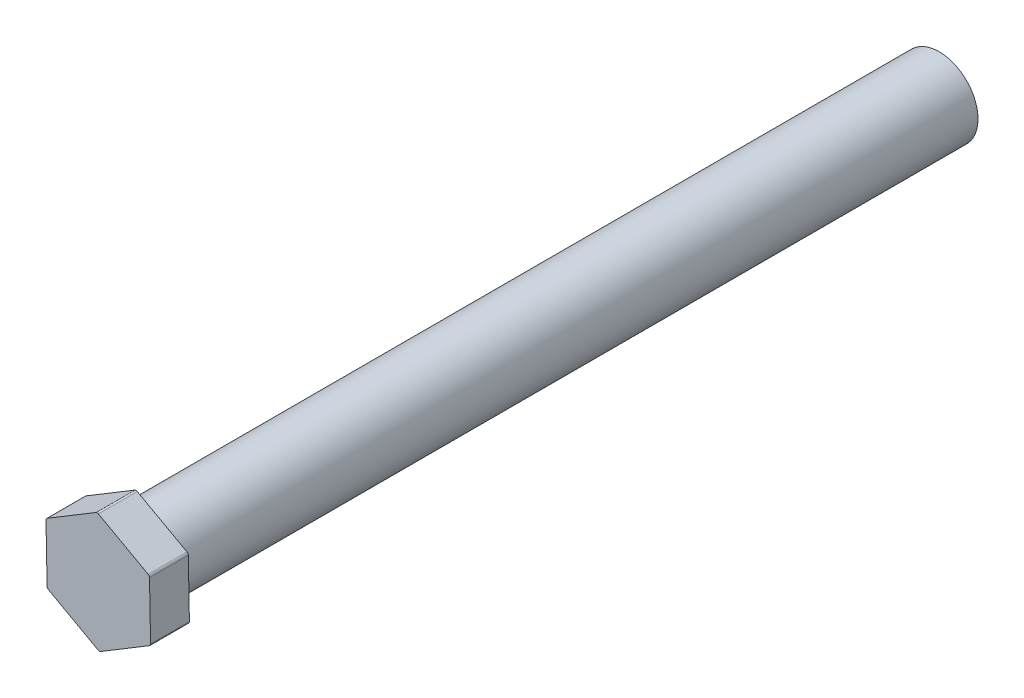
ISO-10303-21;
HEADER;
FILE_DESCRIPTION(('STEP AP214'),'2;1');
FILE_NAME('part.step','',(''),(''),'','','');
FILE_SCHEMA(('AUTOMOTIVE_DESIGN { 1 0 10303 214 1 1 1 1 }'));
ENDSEC;
DATA;
#1=APPLICATION_CONTEXT('core data for automotive mechanical design processes');
#2=APPLICATION_PROTOCOL_DEFINITION('international standard','automotive_design',2000,#1);
#3=PRODUCT_CONTEXT('',#1,'mechanical');
#4=PRODUCT('Part','Part','',(#3));
#5=PRODUCT_RELATED_PRODUCT_CATEGORY('part','',(#4));
#6=PRODUCT_DEFINITION_FORMATION('','',#4);
#7=PRODUCT_DEFINITION_CONTEXT('part definition',#1,'design');
#8=PRODUCT_DEFINITION('design','',#6,#7);
#9=PRODUCT_DEFINITION_SHAPE('','',#8);
#10=(LENGTH_UNIT() NAMED_UNIT(*) SI_UNIT(.MILLI.,.METRE.));
#11=(NAMED_UNIT(*) PLANE_ANGLE_UNIT() SI_UNIT($,.RADIAN.));
#12=(NAMED_UNIT(*) SI_UNIT($,.STERADIAN.) SOLID_ANGLE_UNIT());
#13=UNCERTAINTY_MEASURE_WITH_UNIT(LENGTH_MEASURE(1.E-05),#10,'distance_accuracy_value','');
#14=(GEOMETRIC_REPRESENTATION_CONTEXT(3) GLOBAL_UNCERTAINTY_ASSIGNED_CONTEXT((#13)) GLOBAL_UNIT_ASSIGNED_CONTEXT((#10,
#11,#12)) REPRESENTATION_CONTEXT('',''));
#15=CARTESIAN_POINT('',(0.,0.,0.));
#16=DIRECTION('',(0.,0.,1.));
#17=DIRECTION('',(1.,0.,0.));
#18=AXIS2_PLACEMENT_3D('',#15,#16,#17);
#19=CARTESIAN_POINT('',(-43.2,0.,-62.));
#20=DIRECTION('',(0.,0.,1.));
#21=DIRECTION('',(1.,0.,0.));
#22=AXIS2_PLACEMENT_3D('',#19,#20,#21);
#23=CYLINDRICAL_SURFACE('',#22,3.);
#24=CARTESIAN_POINT('',(-43.2,0.,-62.));
#25=DIRECTION('',(0.,0.,1.));
#26=DIRECTION('',(1.,0.,0.));
#27=AXIS2_PLACEMENT_3D('',#24,#25,#26);
#28=CIRCLE('',#27,3.);
#29=CARTESIAN_POINT('',(-40.2,0.,-62.));
#30=VERTEX_POINT('',#29);
#31=EDGE_CURVE('E11',#30,#30,#28,.T.);
#32=ORIENTED_EDGE('',*,*,#31,.T.);
#33=EDGE_LOOP('',(#32));
#34=FACE_BOUND('',#33,.T.);
#35=CARTESIAN_POINT('',(-43.2,0.,0.));
#36=DIRECTION('',(0.,0.,1.));
#37=DIRECTION('',(1.,0.,0.));
#38=AXIS2_PLACEMENT_3D('',#35,#36,#37);
#39=CIRCLE('',#38,3.);
#40=CARTESIAN_POINT('',(-40.2,0.,0.));
#41=VERTEX_POINT('',#40);
#42=EDGE_CURVE('E43',#41,#41,#39,.T.);
#43=ORIENTED_EDGE('',*,*,#42,.F.);
#44=EDGE_LOOP('',(#43));
#45=FACE_BOUND('',#44,.T.);
#46=ADVANCED_FACE('F40',(#34,#45),#23,.T.);
#47=CARTESIAN_POINT('',(-43.2,0.,-62.));
#48=DIRECTION('',(0.,0.,1.));
#49=DIRECTION('',(1.,0.,0.));
#50=AXIS2_PLACEMENT_3D('',#47,#48,#49);
#51=PLANE('',#50);
#52=ORIENTED_EDGE('',*,*,#31,.F.);
#53=EDGE_LOOP('',(#52));
#54=FACE_BOUND('',#53,.T.);
#55=ADVANCED_FACE('F249',(#54),#51,.F.);
#56=CARTESIAN_POINT('',(-43.2845629857805,4.38790491990159,3.));
#57=DIRECTION('',(0.,0.,-1.));
#58=DIRECTION('',(-1.,0.,0.));
#59=AXIS2_PLACEMENT_3D('',#56,#57,#58);
#60=CYLINDRICAL_SURFACE('',#59,0.2);
#61=CARTESIAN_POINT('',(-43.2845629857805,4.38790491990159,0.));
#62=DIRECTION('',(0.,0.,1.));
#63=DIRECTION('',(1.,0.,0.));
#64=AXIS2_PLACEMENT_3D('',#61,#62,#63);
#65=CIRCLE('',#64,0.2);
#66=CARTESIAN_POINT('',(-43.1879189110778,4.56300467097185,0.));
#67=VERTEX_POINT('',#66);
#68=CARTESIAN_POINT('',(-43.3878817810523,4.55915101925447,0.));
#69=VERTEX_POINT('',#68);
#70=EDGE_CURVE('E167',#67,#69,#65,.T.);
#71=ORIENTED_EDGE('',*,*,#70,.T.);
#72=DIRECTION('',(0.,0.,-1.));
#73=VECTOR('',#72,1.);
#74=CARTESIAN_POINT('',(-43.3878817810523,4.55915101925447,3.));
#75=LINE('',#74,#73);
#76=CARTESIAN_POINT('',(-43.3878817810523,4.55915101925447,3.));
#77=VERTEX_POINT('',#76);
#78=EDGE_CURVE('E236',#77,#69,#75,.T.);
#79=ORIENTED_EDGE('',*,*,#78,.F.);
#80=CARTESIAN_POINT('',(-43.2845629857805,4.38790491990159,3.));
#81=DIRECTION('',(0.,0.,1.));
#82=DIRECTION('',(1.,0.,0.));
#83=AXIS2_PLACEMENT_3D('',#80,#81,#82);
#84=CIRCLE('',#83,0.2);
#85=CARTESIAN_POINT('',(-43.1879189110778,4.56300467097185,3.));
#86=VERTEX_POINT('',#85);
#87=EDGE_CURVE('E203',#86,#77,#84,.T.);
#88=ORIENTED_EDGE('',*,*,#87,.F.);
#89=DIRECTION('',(0.,0.,-1.));
#90=VECTOR('',#89,1.);
#91=CARTESIAN_POINT('',(-43.1879189110778,4.56300467097185,3.));
#92=LINE('',#91,#90);
#93=EDGE_CURVE('E163',#86,#67,#92,.T.);
#94=ORIENTED_EDGE('',*,*,#93,.T.);
#95=EDGE_LOOP('',(#71,#79,#88,#94));
#96=FACE_BOUND('',#95,.T.);
#97=ADVANCED_FACE('F254',(#96),#60,.T.);
#98=CARTESIAN_POINT('',(-43.3878817810523,4.55915101925447,3.));
#99=DIRECTION('',(0.516593976359207,-0.856230496764384,0.));
#100=DIRECTION('',(0.856230496764384,0.516593976359207,0.));
#101=AXIS2_PLACEMENT_3D('',#98,#99,#100);
#102=PLANE('',#101);
#103=DIRECTION('',(-0.856230496764384,-0.516593976359207,0.));
#104=VECTOR('',#103,1.);
#105=CARTESIAN_POINT('',(-43.3878817810523,4.55915101925447,0.));
#106=LINE('',#105,#104);
#107=CARTESIAN_POINT('',(-47.1456374181876,2.29196486539792,0.));
#108=VERTEX_POINT('',#107);
#109=EDGE_CURVE('E171',#69,#108,#106,.T.);
#110=ORIENTED_EDGE('',*,*,#109,.T.);
#111=DIRECTION('',(0.,0.,-1.));
#112=VECTOR('',#111,1.);
#113=CARTESIAN_POINT('',(-47.1456374181876,2.29196486539792,3.));
#114=LINE('',#113,#112);
#115=CARTESIAN_POINT('',(-47.1456374181876,2.29196486539792,3.));
#116=VERTEX_POINT('',#115);
#117=EDGE_CURVE('E232',#116,#108,#114,.T.);
#118=ORIENTED_EDGE('',*,*,#117,.F.);
#119=DIRECTION('',(-0.856230496764384,-0.516593976359207,0.));
#120=VECTOR('',#119,1.);
#121=CARTESIAN_POINT('',(-43.3878817810523,4.55915101925447,3.));
#122=LINE('',#121,#120);
#123=EDGE_CURVE('E113',#77,#116,#122,.T.);
#124=ORIENTED_EDGE('',*,*,#123,.F.);
#125=ORIENTED_EDGE('',*,*,#78,.T.);
#126=EDGE_LOOP('',(#110,#118,#124,#125));
#127=FACE_BOUND('',#126,.T.);
#128=ADVANCED_FACE('F260',(#127),#102,.F.);
#129=CARTESIAN_POINT('',(-47.0423186229158,2.12071876604504,3.));
#130=DIRECTION('',(0.,0.,-1.));
#131=DIRECTION('',(-1.,0.,0.));
#132=AXIS2_PLACEMENT_3D('',#129,#130,#131);
#133=CYLINDRICAL_SURFACE('',#132,0.200000000000001);
#134=CARTESIAN_POINT('',(-47.0423186229158,2.12071876604504,0.));
#135=DIRECTION('',(0.,0.,1.));
#136=DIRECTION('',(1.,0.,0.));
#137=AXIS2_PLACEMENT_3D('',#134,#135,#136);
#138=CIRCLE('',#137,0.200000000000001);
#139=CARTESIAN_POINT('',(-47.2422814928903,2.11686511432766,0.));
#140=VERTEX_POINT('',#139);
#141=EDGE_CURVE('E174',#108,#140,#138,.T.);
#142=ORIENTED_EDGE('',*,*,#141,.T.);
#143=DIRECTION('',(0.,0.,-1.));
#144=VECTOR('',#143,1.);
#145=CARTESIAN_POINT('',(-47.2422814928903,2.11686511432766,3.));
#146=LINE('',#145,#144);
#147=CARTESIAN_POINT('',(-47.2422814928903,2.11686511432766,3.));
#148=VERTEX_POINT('',#147);
#149=EDGE_CURVE('E228',#148,#140,#146,.T.);
#150=ORIENTED_EDGE('',*,*,#149,.F.);
#151=CARTESIAN_POINT('',(-47.0423186229158,2.12071876604504,3.));
#152=DIRECTION('',(0.,0.,1.));
#153=DIRECTION('',(1.,0.,0.));
#154=AXIS2_PLACEMENT_3D('',#151,#152,#153);
#155=CIRCLE('',#154,0.200000000000001);
#156=EDGE_CURVE('E438',#116,#148,#155,.T.);
#157=ORIENTED_EDGE('',*,*,#156,.F.);
#158=ORIENTED_EDGE('',*,*,#117,.T.);
#159=EDGE_LOOP('',(#142,#150,#157,#158));
#160=FACE_BOUND('',#159,.T.);
#161=ADVANCED_FACE('F266',(#160),#133,.T.);
#162=CARTESIAN_POINT('',(-47.2422814928903,2.11686511432766,3.));
#163=DIRECTION('',(0.999814349872529,0.0192682585868978,0.));
#164=DIRECTION('',(-0.0192682585868978,0.999814349872529,0.));
#165=AXIS2_PLACEMENT_3D('',#162,#163,#164);
#166=PLANE('',#165);
#167=DIRECTION('',(0.0192682585868978,-0.999814349872529,0.));
#168=VECTOR('',#167,1.);
#169=CARTESIAN_POINT('',(-47.2422814928903,2.11686511432766,0.));
#170=LINE('',#169,#168);
#171=CARTESIAN_POINT('',(-47.1577185071098,-2.27103980557393,0.));
#172=VERTEX_POINT('',#171);
#173=EDGE_CURVE('E177',#140,#172,#170,.T.);
#174=ORIENTED_EDGE('',*,*,#173,.T.);
#175=DIRECTION('',(0.,0.,-1.));
#176=VECTOR('',#175,1.);
#177=CARTESIAN_POINT('',(-47.1577185071098,-2.27103980557393,3.));
#178=LINE('',#177,#176);
#179=CARTESIAN_POINT('',(-47.1577185071098,-2.27103980557393,3.));
#180=VERTEX_POINT('',#179);
#181=EDGE_CURVE('E225',#180,#172,#178,.T.);
#182=ORIENTED_EDGE('',*,*,#181,.F.);
#183=DIRECTION('',(0.0192682585868978,-0.999814349872529,0.));
#184=VECTOR('',#183,1.);
#185=CARTESIAN_POINT('',(-47.2422814928903,2.11686511432766,3.));
#186=LINE('',#185,#184);
#187=EDGE_CURVE('E443',#148,#180,#186,.T.);
#188=ORIENTED_EDGE('',*,*,#187,.F.);
#189=ORIENTED_EDGE('',*,*,#149,.T.);
#190=EDGE_LOOP('',(#174,#182,#188,#189));
#191=FACE_BOUND('',#190,.T.);
#192=ADVANCED_FACE('F269',(#191),#166,.F.);
#193=CARTESIAN_POINT('',(-46.9577556371353,-2.26718615385655,3.));
#194=DIRECTION('',(0.,0.,-1.));
#195=DIRECTION('',(-1.,0.,0.));
#196=AXIS2_PLACEMENT_3D('',#193,#194,#195);
#197=CYLINDRICAL_SURFACE('',#196,0.200000000000005);
#198=CARTESIAN_POINT('',(-46.9577556371353,-2.26718615385655,0.));
#199=DIRECTION('',(0.,0.,-1.));
#200=DIRECTION('',(-1.,0.,0.));
#201=AXIS2_PLACEMENT_3D('',#198,#199,#200);
#202=CIRCLE('',#201,0.200000000000005);
#203=CARTESIAN_POINT('',(-47.0543997118379,-2.44228590492681,0.));
#204=VERTEX_POINT('',#203);
#205=EDGE_CURVE('E181',#204,#172,#202,.T.);
#206=ORIENTED_EDGE('',*,*,#205,.F.);
#207=DIRECTION('',(0.,0.,-1.));
#208=VECTOR('',#207,1.);
#209=CARTESIAN_POINT('',(-47.0543997118379,-2.44228590492681,3.));
#210=LINE('',#209,#208);
#211=CARTESIAN_POINT('',(-47.0543997118379,-2.44228590492681,3.));
#212=VERTEX_POINT('',#211);
#213=EDGE_CURVE('E222',#212,#204,#210,.T.);
#214=ORIENTED_EDGE('',*,*,#213,.F.);
#215=CARTESIAN_POINT('',(-46.9577556371353,-2.26718615385655,3.));
#216=DIRECTION('',(0.,0.,-1.));
#217=DIRECTION('',(-1.,0.,0.));
#218=AXIS2_PLACEMENT_3D('',#215,#216,#217);
#219=CIRCLE('',#218,0.200000000000005);
#220=EDGE_CURVE('E446',#212,#180,#219,.T.);
#221=ORIENTED_EDGE('',*,*,#220,.T.);
#222=ORIENTED_EDGE('',*,*,#181,.T.);
#223=EDGE_LOOP('',(#206,#214,#221,#222));
#224=FACE_BOUND('',#223,.T.);
#225=ADVANCED_FACE('F273',(#224),#197,.T.);
#226=CARTESIAN_POINT('',(-47.0543997118379,-2.44228590492681,3.));
#227=DIRECTION('',(0.483220373513321,0.875498755351283,0.));
#228=DIRECTION('',(-0.875498755351283,0.483220373513322,0.));
#229=AXIS2_PLACEMENT_3D('',#226,#227,#228);
#230=PLANE('',#229);
#231=DIRECTION('',(0.875498755351283,-0.483220373513321,0.));
#232=VECTOR('',#231,1.);
#233=CARTESIAN_POINT('',(-47.0543997118379,-2.44228590492681,0.));
#234=LINE('',#233,#232);
#235=CARTESIAN_POINT('',(-43.2120810889222,-4.56300467097185,0.));
#236=VERTEX_POINT('',#235);
#237=EDGE_CURVE('E185',#204,#236,#234,.T.);
#238=ORIENTED_EDGE('',*,*,#237,.T.);
#239=DIRECTION('',(0.,0.,-1.));
#240=VECTOR('',#239,1.);
#241=CARTESIAN_POINT('',(-43.2120810889222,-4.56300467097185,3.));
#242=LINE('',#241,#240);
#243=CARTESIAN_POINT('',(-43.2120810889222,-4.56300467097185,3.));
#244=VERTEX_POINT('',#243);
#245=EDGE_CURVE('E218',#244,#236,#242,.T.);
#246=ORIENTED_EDGE('',*,*,#245,.F.);
#247=DIRECTION('',(0.875498755351283,-0.483220373513321,0.));
#248=VECTOR('',#247,1.);
#249=CARTESIAN_POINT('',(-47.0543997118379,-2.44228590492681,3.));
#250=LINE('',#249,#248);
#251=EDGE_CURVE('E450',#212,#244,#250,.T.);
#252=ORIENTED_EDGE('',*,*,#251,.F.);
#253=ORIENTED_EDGE('',*,*,#213,.T.);
#254=EDGE_LOOP('',(#238,#246,#252,#253));
#255=FACE_BOUND('',#254,.T.);
#256=ADVANCED_FACE('F277',(#255),#230,.F.);
#257=CARTESIAN_POINT('',(-43.1154370142195,-4.38790491990159,3.));
#258=DIRECTION('',(0.,0.,-1.));
#259=DIRECTION('',(-1.,0.,0.));
#260=AXIS2_PLACEMENT_3D('',#257,#258,#259);
#261=CYLINDRICAL_SURFACE('',#260,0.199999999999996);
#262=CARTESIAN_POINT('',(-43.1154370142195,-4.38790491990159,0.));
#263=DIRECTION('',(0.,0.,1.));
#264=DIRECTION('',(1.,0.,0.));
#265=AXIS2_PLACEMENT_3D('',#262,#263,#264);
#266=CIRCLE('',#265,0.199999999999996);
#267=CARTESIAN_POINT('',(-43.0121182189477,-4.55915101925447,0.));
#268=VERTEX_POINT('',#267);
#269=EDGE_CURVE('E188',#236,#268,#266,.T.);
#270=ORIENTED_EDGE('',*,*,#269,.T.);
#271=DIRECTION('',(0.,0.,-1.));
#272=VECTOR('',#271,1.);
#273=CARTESIAN_POINT('',(-43.0121182189477,-4.55915101925447,3.));
#274=LINE('',#273,#272);
#275=CARTESIAN_POINT('',(-43.0121182189477,-4.55915101925447,3.));
#276=VERTEX_POINT('',#275);
#277=EDGE_CURVE('E214',#276,#268,#274,.T.);
#278=ORIENTED_EDGE('',*,*,#277,.F.);
#279=CARTESIAN_POINT('',(-43.1154370142195,-4.38790491990159,3.));
#280=DIRECTION('',(0.,0.,1.));
#281=DIRECTION('',(1.,0.,0.));
#282=AXIS2_PLACEMENT_3D('',#279,#280,#281);
#283=CIRCLE('',#282,0.199999999999996);
#284=EDGE_CURVE('E453',#244,#276,#283,.T.);
#285=ORIENTED_EDGE('',*,*,#284,.F.);
#286=ORIENTED_EDGE('',*,*,#245,.T.);
#287=EDGE_LOOP('',(#270,#278,#285,#286));
#288=FACE_BOUND('',#287,.T.);
#289=ADVANCED_FACE('F281',(#288),#261,.T.);
#290=CARTESIAN_POINT('',(-43.0121182189477,-4.55915101925446,3.));
#291=DIRECTION('',(-0.516593976359206,0.856230496764384,0.));
#292=DIRECTION('',(-0.856230496764384,-0.516593976359206,0.));
#293=AXIS2_PLACEMENT_3D('',#290,#291,#292);
#294=PLANE('',#293);
#295=DIRECTION('',(0.856230496764384,0.516593976359206,0.));
#296=VECTOR('',#295,1.);
#297=CARTESIAN_POINT('',(-43.0121182189477,-4.55915101925446,0.));
#298=LINE('',#297,#296);
#299=CARTESIAN_POINT('',(-39.2543625818124,-2.29196486539792,0.));
#300=VERTEX_POINT('',#299);
#301=EDGE_CURVE('E191',#268,#300,#298,.T.);
#302=ORIENTED_EDGE('',*,*,#301,.T.);
#303=DIRECTION('',(0.,0.,-1.));
#304=VECTOR('',#303,1.);
#305=CARTESIAN_POINT('',(-39.2543625818124,-2.29196486539792,3.));
#306=LINE('',#305,#304);
#307=CARTESIAN_POINT('',(-39.2543625818124,-2.29196486539792,3.));
#308=VERTEX_POINT('',#307);
#309=EDGE_CURVE('E210',#308,#300,#306,.T.);
#310=ORIENTED_EDGE('',*,*,#309,.F.);
#311=DIRECTION('',(0.856230496764384,0.516593976359206,0.));
#312=VECTOR('',#311,1.);
#313=CARTESIAN_POINT('',(-43.0121182189477,-4.55915101925446,3.));
#314=LINE('',#313,#312);
#315=EDGE_CURVE('E456',#276,#308,#314,.T.);
#316=ORIENTED_EDGE('',*,*,#315,.F.);
#317=ORIENTED_EDGE('',*,*,#277,.T.);
#318=EDGE_LOOP('',(#302,#310,#316,#317));
#319=FACE_BOUND('',#318,.T.);
#320=ADVANCED_FACE('F285',(#319),#294,.F.);
#321=CARTESIAN_POINT('',(-39.3576813770843,-2.12071876604504,3.));
#322=DIRECTION('',(0.,0.,-1.));
#323=DIRECTION('',(-1.,0.,0.));
#324=AXIS2_PLACEMENT_3D('',#321,#322,#323);
#325=CYLINDRICAL_SURFACE('',#324,0.200000000000006);
#326=CARTESIAN_POINT('',(-39.3576813770843,-2.12071876604504,0.));
#327=DIRECTION('',(0.,0.,1.));
#328=DIRECTION('',(1.,0.,0.));
#329=AXIS2_PLACEMENT_3D('',#326,#327,#328);
#330=CIRCLE('',#329,0.200000000000006);
#331=CARTESIAN_POINT('',(-39.1577185071098,-2.11686511432766,0.));
#332=VERTEX_POINT('',#331);
#333=EDGE_CURVE('E194',#300,#332,#330,.T.);
#334=ORIENTED_EDGE('',*,*,#333,.T.);
#335=DIRECTION('',(0.,0.,-1.));
#336=VECTOR('',#335,1.);
#337=CARTESIAN_POINT('',(-39.1577185071098,-2.11686511432766,3.));
#338=LINE('',#337,#336);
#339=CARTESIAN_POINT('',(-39.1577185071098,-2.11686511432766,3.));
#340=VERTEX_POINT('',#339);
#341=EDGE_CURVE('E155',#340,#332,#338,.T.);
#342=ORIENTED_EDGE('',*,*,#341,.F.);
#343=CARTESIAN_POINT('',(-39.3576813770843,-2.12071876604504,3.));
#344=DIRECTION('',(0.,0.,1.));
#345=DIRECTION('',(1.,0.,0.));
#346=AXIS2_PLACEMENT_3D('',#343,#344,#345);
#347=CIRCLE('',#346,0.200000000000006);
#348=EDGE_CURVE('E144',#308,#340,#347,.T.);
#349=ORIENTED_EDGE('',*,*,#348,.F.);
#350=ORIENTED_EDGE('',*,*,#309,.T.);
#351=EDGE_LOOP('',(#334,#342,#349,#350));
#352=FACE_BOUND('',#351,.T.);
#353=ADVANCED_FACE('F289',(#352),#325,.T.);
#354=CARTESIAN_POINT('',(-39.1577185071098,-2.11686511432766,3.));
#355=DIRECTION('',(-0.999814349872529,-0.0192682585868978,0.));
#356=DIRECTION('',(0.0192682585868978,-0.999814349872529,0.));
#357=AXIS2_PLACEMENT_3D('',#354,#355,#356);
#358=PLANE('',#357);
#359=DIRECTION('',(-0.0192682585868978,0.999814349872529,0.));
#360=VECTOR('',#359,1.);
#361=CARTESIAN_POINT('',(-39.1577185071098,-2.11686511432766,0.));
#362=LINE('',#361,#360);
#363=CARTESIAN_POINT('',(-39.2422814928903,2.27103980557393,0.));
#364=VERTEX_POINT('',#363);
#365=EDGE_CURVE('E153',#332,#364,#362,.T.);
#366=ORIENTED_EDGE('',*,*,#365,.T.);
#367=DIRECTION('',(0.,0.,-1.));
#368=VECTOR('',#367,1.);
#369=CARTESIAN_POINT('',(-39.2422814928903,2.27103980557393,3.));
#370=LINE('',#369,#368);
#371=CARTESIAN_POINT('',(-39.2422814928903,2.27103980557393,3.));
#372=VERTEX_POINT('',#371);
#373=EDGE_CURVE('E150',#372,#364,#370,.T.);
#374=ORIENTED_EDGE('',*,*,#373,.F.);
#375=DIRECTION('',(-0.0192682585868978,0.999814349872529,0.));
#376=VECTOR('',#375,1.);
#377=CARTESIAN_POINT('',(-39.1577185071098,-2.11686511432766,3.));
#378=LINE('',#377,#376);
#379=EDGE_CURVE('E138',#340,#372,#378,.T.);
#380=ORIENTED_EDGE('',*,*,#379,.F.);
#381=ORIENTED_EDGE('',*,*,#341,.T.);
#382=EDGE_LOOP('',(#366,#374,#380,#381));
#383=FACE_BOUND('',#382,.T.);
#384=ADVANCED_FACE('F151',(#383),#358,.F.);
#385=CARTESIAN_POINT('',(-39.4422443628648,2.26718615385655,3.));
#386=DIRECTION('',(0.,0.,-1.));
#387=DIRECTION('',(-1.,0.,0.));
#388=AXIS2_PLACEMENT_3D('',#385,#386,#387);
#389=CYLINDRICAL_SURFACE('',#388,0.200000000000006);
#390=CARTESIAN_POINT('',(-39.4422443628648,2.26718615385655,0.));
#391=DIRECTION('',(0.,0.,1.));
#392=DIRECTION('',(1.,0.,0.));
#393=AXIS2_PLACEMENT_3D('',#390,#391,#392);
#394=CIRCLE('',#393,0.200000000000006);
#395=CARTESIAN_POINT('',(-39.3456002881621,2.44228590492682,0.));
#396=VERTEX_POINT('',#395);
#397=EDGE_CURVE('E98',#364,#396,#394,.T.);
#398=ORIENTED_EDGE('',*,*,#397,.T.);
#399=DIRECTION('',(0.,0.,-1.));
#400=VECTOR('',#399,1.);
#401=CARTESIAN_POINT('',(-39.3456002881621,2.44228590492682,3.));
#402=LINE('',#401,#400);
#403=CARTESIAN_POINT('',(-39.3456002881621,2.44228590492682,3.));
#404=VERTEX_POINT('',#403);
#405=EDGE_CURVE('E156',#404,#396,#402,.T.);
#406=ORIENTED_EDGE('',*,*,#405,.F.);
#407=CARTESIAN_POINT('',(-39.4422443628648,2.26718615385655,3.));
#408=DIRECTION('',(0.,0.,1.));
#409=DIRECTION('',(1.,0.,0.));
#410=AXIS2_PLACEMENT_3D('',#407,#408,#409);
#411=CIRCLE('',#410,0.200000000000006);
#412=EDGE_CURVE('E142',#372,#404,#411,.T.);
#413=ORIENTED_EDGE('',*,*,#412,.F.);
#414=ORIENTED_EDGE('',*,*,#373,.T.);
#415=EDGE_LOOP('',(#398,#406,#413,#414));
#416=FACE_BOUND('',#415,.T.);
#417=ADVANCED_FACE('F158',(#416),#389,.T.);
#418=CARTESIAN_POINT('',(-39.3456002881621,2.44228590492681,3.));
#419=DIRECTION('',(-0.483220373513323,-0.875498755351283,0.));
#420=DIRECTION('',(0.875498755351283,-0.483220373513323,0.));
#421=AXIS2_PLACEMENT_3D('',#418,#419,#420);
#422=PLANE('',#421);
#423=DIRECTION('',(-0.875498755351282,0.483220373513323,0.));
#424=VECTOR('',#423,1.);
#425=CARTESIAN_POINT('',(-39.3456002881621,2.44228590492681,0.));
#426=LINE('',#425,#424);
#427=EDGE_CURVE('E104',#396,#67,#426,.T.);
#428=ORIENTED_EDGE('',*,*,#427,.T.);
#429=ORIENTED_EDGE('',*,*,#93,.F.);
#430=DIRECTION('',(-0.875498755351282,0.483220373513323,0.));
#431=VECTOR('',#430,1.);
#432=CARTESIAN_POINT('',(-39.3456002881621,2.44228590492681,3.));
#433=LINE('',#432,#431);
#434=EDGE_CURVE('E57',#404,#86,#433,.T.);
#435=ORIENTED_EDGE('',*,*,#434,.F.);
#436=ORIENTED_EDGE('',*,*,#405,.T.);
#437=EDGE_LOOP('',(#428,#429,#435,#436));
#438=FACE_BOUND('',#437,.T.);
#439=ADVANCED_FACE('F298',(#438),#422,.F.);
#440=CARTESIAN_POINT('',(-43.2845629857805,4.38790491990159,3.));
#441=DIRECTION('',(0.,0.,1.));
#442=DIRECTION('',(1.,0.,0.));
#443=AXIS2_PLACEMENT_3D('',#440,#441,#442);
#444=PLANE('',#443);
#445=ORIENTED_EDGE('',*,*,#87,.T.);
#446=ORIENTED_EDGE('',*,*,#123,.T.);
#447=ORIENTED_EDGE('',*,*,#156,.T.);
#448=ORIENTED_EDGE('',*,*,#187,.T.);
#449=ORIENTED_EDGE('',*,*,#220,.F.);
#450=ORIENTED_EDGE('',*,*,#251,.T.);
#451=ORIENTED_EDGE('',*,*,#284,.T.);
#452=ORIENTED_EDGE('',*,*,#315,.T.);
#453=ORIENTED_EDGE('',*,*,#348,.T.);
#454=ORIENTED_EDGE('',*,*,#379,.T.);
#455=ORIENTED_EDGE('',*,*,#412,.T.);
#456=ORIENTED_EDGE('',*,*,#434,.T.);
#457=EDGE_LOOP('',(#445,#446,#447,#448,#449,#450,#451,#452,#453,#454,#455,#456));
#458=FACE_BOUND('',#457,.T.);
#459=ADVANCED_FACE('F140',(#458),#444,.T.);
#460=CARTESIAN_POINT('',(-43.2845629857805,4.38790491990159,0.));
#461=DIRECTION('',(0.,0.,1.));
#462=DIRECTION('',(1.,0.,0.));
#463=AXIS2_PLACEMENT_3D('',#460,#461,#462);
#464=PLANE('',#463);
#465=ORIENTED_EDGE('',*,*,#42,.T.);
#466=EDGE_LOOP('',(#465));
#467=FACE_BOUND('',#466,.T.);
#468=ORIENTED_EDGE('',*,*,#70,.F.);
#469=ORIENTED_EDGE('',*,*,#427,.F.);
#470=ORIENTED_EDGE('',*,*,#397,.F.);
#471=ORIENTED_EDGE('',*,*,#365,.F.);
#472=ORIENTED_EDGE('',*,*,#333,.F.);
#473=ORIENTED_EDGE('',*,*,#301,.F.);
#474=ORIENTED_EDGE('',*,*,#269,.F.);
#475=ORIENTED_EDGE('',*,*,#237,.F.);
#476=ORIENTED_EDGE('',*,*,#205,.T.);
#477=ORIENTED_EDGE('',*,*,#173,.F.);
#478=ORIENTED_EDGE('',*,*,#141,.F.);
#479=ORIENTED_EDGE('',*,*,#109,.F.);
#480=EDGE_LOOP('',(#468,#469,#470,#471,#472,#473,#474,#475,#476,#477,#478,#479));
#481=FACE_BOUND('',#480,.T.);
#482=ADVANCED_FACE('F245',(#467,#481),#464,.F.);
#483=CLOSED_SHELL('',(#46,#55,#97,#128,#161,#192,#225,#256,#289,#320,#353,#384,#417,#439,#459,#482));
#484=MANIFOLD_SOLID_BREP('B2',#483);
#485=ADVANCED_BREP_SHAPE_REPRESENTATION('',(#18,#484),#14);
#486=SHAPE_DEFINITION_REPRESENTATION(#9,#485);
ENDSEC;
END-ISO-10303-21;
